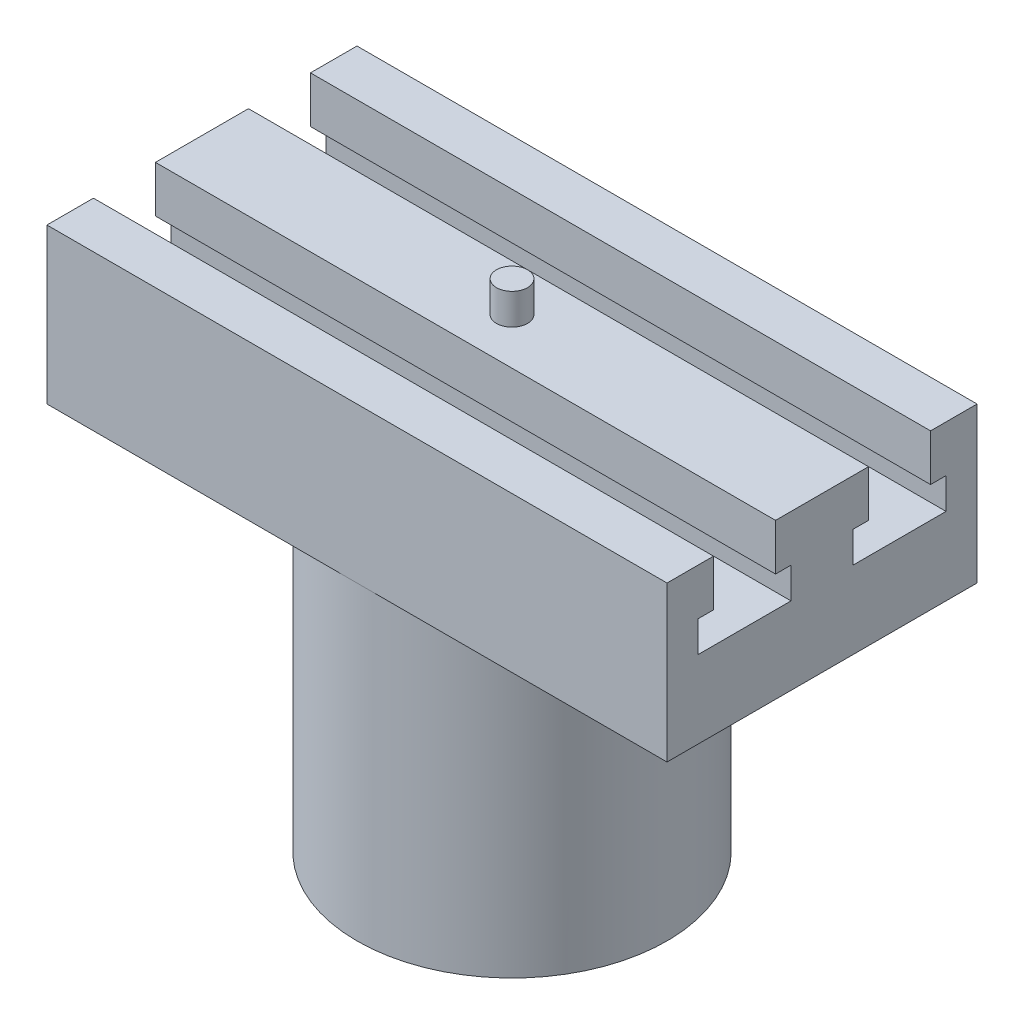
ISO-10303-21;
HEADER;
FILE_DESCRIPTION(('STEP AP214'),'2;1');
FILE_NAME('part.step','',(''),(''),'','','');
FILE_SCHEMA(('AUTOMOTIVE_DESIGN { 1 0 10303 214 1 1 1 1 }'));
ENDSEC;
DATA;
#1=APPLICATION_CONTEXT('core data for automotive mechanical design processes');
#2=APPLICATION_PROTOCOL_DEFINITION('international standard','automotive_design',2000,#1);
#3=PRODUCT_CONTEXT('',#1,'mechanical');
#4=PRODUCT('Part','Part','',(#3));
#5=PRODUCT_RELATED_PRODUCT_CATEGORY('part','',(#4));
#6=PRODUCT_DEFINITION_FORMATION('','',#4);
#7=PRODUCT_DEFINITION_CONTEXT('part definition',#1,'design');
#8=PRODUCT_DEFINITION('design','',#6,#7);
#9=PRODUCT_DEFINITION_SHAPE('','',#8);
#10=(LENGTH_UNIT() NAMED_UNIT(*) SI_UNIT(.MILLI.,.METRE.));
#11=(NAMED_UNIT(*) PLANE_ANGLE_UNIT() SI_UNIT($,.RADIAN.));
#12=(NAMED_UNIT(*) SI_UNIT($,.STERADIAN.) SOLID_ANGLE_UNIT());
#13=UNCERTAINTY_MEASURE_WITH_UNIT(LENGTH_MEASURE(1.E-05),#10,'distance_accuracy_value','');
#14=(GEOMETRIC_REPRESENTATION_CONTEXT(3) GLOBAL_UNCERTAINTY_ASSIGNED_CONTEXT((#13)) GLOBAL_UNIT_ASSIGNED_CONTEXT((#10,
#11,#12)) REPRESENTATION_CONTEXT('',''));
#15=CARTESIAN_POINT('',(0.,0.,0.));
#16=DIRECTION('',(0.,0.,1.));
#17=DIRECTION('',(1.,0.,0.));
#18=AXIS2_PLACEMENT_3D('',#15,#16,#17);
#19=CARTESIAN_POINT('',(0.,150.,0.));
#20=DIRECTION('',(0.,1.,0.));
#21=DIRECTION('',(0.,0.,1.));
#22=AXIS2_PLACEMENT_3D('',#19,#20,#21);
#23=PLANE('',#22);
#24=CARTESIAN_POINT('',(0.,150.,0.));
#25=DIRECTION('',(0.,1.,0.));
#26=DIRECTION('',(0.,0.,1.));
#27=AXIS2_PLACEMENT_3D('',#24,#25,#26);
#28=CIRCLE('',#27,5.);
#29=CARTESIAN_POINT('',(0.,150.,5.));
#30=VERTEX_POINT('',#29);
#31=EDGE_CURVE('E223',#30,#30,#28,.T.);
#32=ORIENTED_EDGE('',*,*,#31,.F.);
#33=EDGE_LOOP('',(#32));
#34=FACE_BOUND('',#33,.T.);
#35=DIRECTION('',(1.,0.,0.));
#36=VECTOR('',#35,1.);
#37=CARTESIAN_POINT('',(-100.,150.,15.0000000000001));
#38=LINE('',#37,#36);
#39=CARTESIAN_POINT('',(-100.,150.,15.0000000000001));
#40=VERTEX_POINT('',#39);
#41=CARTESIAN_POINT('',(100.,150.,15.));
#42=VERTEX_POINT('',#41);
#43=EDGE_CURVE('E264',#40,#42,#38,.T.);
#44=ORIENTED_EDGE('',*,*,#43,.T.);
#45=DIRECTION('',(0.,0.,-1.));
#46=VECTOR('',#45,1.);
#47=CARTESIAN_POINT('',(100.,150.,-50.));
#48=LINE('',#47,#46);
#49=CARTESIAN_POINT('',(100.,150.,-15.));
#50=VERTEX_POINT('',#49);
#51=EDGE_CURVE('E368',#42,#50,#48,.T.);
#52=ORIENTED_EDGE('',*,*,#51,.T.);
#53=DIRECTION('',(1.,0.,0.));
#54=VECTOR('',#53,1.);
#55=CARTESIAN_POINT('',(-100.,150.,-14.9999999999999));
#56=LINE('',#55,#54);
#57=CARTESIAN_POINT('',(-100.,150.,-14.9999999999999));
#58=VERTEX_POINT('',#57);
#59=EDGE_CURVE('E292',#58,#50,#56,.T.);
#60=ORIENTED_EDGE('',*,*,#59,.F.);
#61=DIRECTION('',(0.,0.,1.));
#62=VECTOR('',#61,1.);
#63=CARTESIAN_POINT('',(-100.,150.,-50.));
#64=LINE('',#63,#62);
#65=EDGE_CURVE('E377',#58,#40,#64,.T.);
#66=ORIENTED_EDGE('',*,*,#65,.T.);
#67=EDGE_LOOP('',(#44,#52,#60,#66));
#68=FACE_BOUND('',#67,.T.);
#69=ADVANCED_FACE('F47',(#34,#68),#23,.T.);
#70=DIRECTION('',(1.,0.,0.));
#71=VECTOR('',#70,1.);
#72=CARTESIAN_POINT('',(-100.,150.,35.0000000000001));
#73=LINE('',#72,#71);
#74=CARTESIAN_POINT('',(-100.,150.,35.0000000000001));
#75=VERTEX_POINT('',#74);
#76=CARTESIAN_POINT('',(100.,150.,35.));
#77=VERTEX_POINT('',#76);
#78=EDGE_CURVE('E200',#75,#77,#73,.T.);
#79=ORIENTED_EDGE('',*,*,#78,.F.);
#80=CARTESIAN_POINT('',(-100.,150.,50.));
#81=VERTEX_POINT('',#80);
#82=EDGE_CURVE('E215',#75,#81,#64,.T.);
#83=ORIENTED_EDGE('',*,*,#82,.T.);
#84=DIRECTION('',(1.,0.,0.));
#85=VECTOR('',#84,1.);
#86=CARTESIAN_POINT('',(-100.,150.,50.));
#87=LINE('',#86,#85);
#88=CARTESIAN_POINT('',(100.,150.,50.));
#89=VERTEX_POINT('',#88);
#90=EDGE_CURVE('E376',#81,#89,#87,.T.);
#91=ORIENTED_EDGE('',*,*,#90,.T.);
#92=EDGE_CURVE('E363',#89,#77,#48,.T.);
#93=ORIENTED_EDGE('',*,*,#92,.T.);
#94=EDGE_LOOP('',(#79,#83,#91,#93));
#95=FACE_BOUND('',#94,.T.);
#96=ADVANCED_FACE('F488',(#95),#23,.T.);
#97=CARTESIAN_POINT('',(0.,100.,0.));
#98=DIRECTION('',(0.,-1.,0.));
#99=DIRECTION('',(0.,0.,-1.));
#100=AXIS2_PLACEMENT_3D('',#97,#98,#99);
#101=CYLINDRICAL_SURFACE('',#100,50.);
#102=CARTESIAN_POINT('',(0.,100.,0.));
#103=DIRECTION('',(0.,1.,0.));
#104=DIRECTION('',(0.,0.,1.));
#105=AXIS2_PLACEMENT_3D('',#102,#103,#104);
#106=CIRCLE('',#105,50.);
#107=CARTESIAN_POINT('',(0.,100.,50.));
#108=VERTEX_POINT('',#107);
#109=CARTESIAN_POINT('',(0.,100.,-50.));
#110=VERTEX_POINT('',#109);
#111=EDGE_CURVE('E11',#108,#110,#106,.T.);
#112=ORIENTED_EDGE('',*,*,#111,.F.);
#113=EDGE_CURVE('E57',#110,#108,#106,.T.);
#114=ORIENTED_EDGE('',*,*,#113,.F.);
#115=EDGE_LOOP('',(#112,#114));
#116=FACE_BOUND('',#115,.T.);
#117=CARTESIAN_POINT('',(0.,0.,0.));
#118=DIRECTION('',(0.,1.,0.));
#119=DIRECTION('',(0.,0.,1.));
#120=AXIS2_PLACEMENT_3D('',#117,#118,#119);
#121=CIRCLE('',#120,50.);
#122=CARTESIAN_POINT('',(0.,0.,50.));
#123=VERTEX_POINT('',#122);
#124=EDGE_CURVE('E51',#123,#123,#121,.T.);
#125=ORIENTED_EDGE('',*,*,#124,.T.);
#126=EDGE_LOOP('',(#125));
#127=FACE_BOUND('',#126,.T.);
#128=ADVANCED_FACE('F49',(#116,#127),#101,.T.);
#129=CARTESIAN_POINT('',(0.,0.,0.));
#130=DIRECTION('',(0.,1.,0.));
#131=DIRECTION('',(0.,0.,1.));
#132=AXIS2_PLACEMENT_3D('',#129,#130,#131);
#133=PLANE('',#132);
#134=ORIENTED_EDGE('',*,*,#124,.F.);
#135=EDGE_LOOP('',(#134));
#136=FACE_BOUND('',#135,.T.);
#137=ADVANCED_FACE('F496',(#136),#133,.F.);
#138=CARTESIAN_POINT('',(0.,100.,0.));
#139=DIRECTION('',(0.,1.,0.));
#140=DIRECTION('',(0.,0.,1.));
#141=AXIS2_PLACEMENT_3D('',#138,#139,#140);
#142=PLANE('',#141);
#143=DIRECTION('',(1.,0.,0.));
#144=VECTOR('',#143,1.);
#145=CARTESIAN_POINT('',(-100.,100.,50.));
#146=LINE('',#145,#144);
#147=CARTESIAN_POINT('',(100.,100.,50.));
#148=VERTEX_POINT('',#147);
#149=EDGE_CURVE('E392',#108,#148,#146,.T.);
#150=ORIENTED_EDGE('',*,*,#149,.F.);
#151=ORIENTED_EDGE('',*,*,#111,.T.);
#152=DIRECTION('',(-1.,0.,0.));
#153=VECTOR('',#152,1.);
#154=CARTESIAN_POINT('',(-100.,100.,-50.));
#155=LINE('',#154,#153);
#156=CARTESIAN_POINT('',(100.,100.,-50.));
#157=VERTEX_POINT('',#156);
#158=EDGE_CURVE('E385',#157,#110,#155,.T.);
#159=ORIENTED_EDGE('',*,*,#158,.F.);
#160=DIRECTION('',(0.,0.,-1.));
#161=VECTOR('',#160,1.);
#162=CARTESIAN_POINT('',(100.,100.,-50.));
#163=LINE('',#162,#161);
#164=EDGE_CURVE('E268',#148,#157,#163,.T.);
#165=ORIENTED_EDGE('',*,*,#164,.F.);
#166=EDGE_LOOP('',(#150,#151,#159,#165));
#167=FACE_BOUND('',#166,.T.);
#168=ADVANCED_FACE('F429',(#167),#142,.F.);
#169=CARTESIAN_POINT('',(-100.,100.,-50.));
#170=VERTEX_POINT('',#169);
#171=EDGE_CURVE('E384',#110,#170,#155,.T.);
#172=ORIENTED_EDGE('',*,*,#171,.F.);
#173=ORIENTED_EDGE('',*,*,#113,.T.);
#174=CARTESIAN_POINT('',(-100.,100.,50.));
#175=VERTEX_POINT('',#174);
#176=EDGE_CURVE('E393',#175,#108,#146,.T.);
#177=ORIENTED_EDGE('',*,*,#176,.F.);
#178=DIRECTION('',(0.,0.,1.));
#179=VECTOR('',#178,1.);
#180=CARTESIAN_POINT('',(-100.,100.,-50.));
#181=LINE('',#180,#179);
#182=EDGE_CURVE('E389',#170,#175,#181,.T.);
#183=ORIENTED_EDGE('',*,*,#182,.F.);
#184=EDGE_LOOP('',(#172,#173,#177,#183));
#185=FACE_BOUND('',#184,.T.);
#186=ADVANCED_FACE('F424',(#185),#142,.F.);
#187=CARTESIAN_POINT('',(100.,150.,-50.));
#188=DIRECTION('',(-1.,0.,0.));
#189=DIRECTION('',(0.,0.,1.));
#190=AXIS2_PLACEMENT_3D('',#187,#188,#189);
#191=PLANE('',#190);
#192=ORIENTED_EDGE('',*,*,#51,.F.);
#193=DIRECTION('',(0.,1.,0.));
#194=VECTOR('',#193,1.);
#195=CARTESIAN_POINT('',(100.,150.,15.));
#196=LINE('',#195,#194);
#197=CARTESIAN_POINT('',(100.,135.,15.));
#198=VERTEX_POINT('',#197);
#199=EDGE_CURVE('E217',#198,#42,#196,.T.);
#200=ORIENTED_EDGE('',*,*,#199,.F.);
#201=DIRECTION('',(0.,0.,1.));
#202=VECTOR('',#201,1.);
#203=CARTESIAN_POINT('',(100.,135.,15.));
#204=LINE('',#203,#202);
#205=CARTESIAN_POINT('',(100.,135.,10.));
#206=VERTEX_POINT('',#205);
#207=EDGE_CURVE('E220',#206,#198,#204,.T.);
#208=ORIENTED_EDGE('',*,*,#207,.F.);
#209=DIRECTION('',(0.,1.,0.));
#210=VECTOR('',#209,1.);
#211=CARTESIAN_POINT('',(100.,135.,10.));
#212=LINE('',#211,#210);
#213=CARTESIAN_POINT('',(100.,125.,10.));
#214=VERTEX_POINT('',#213);
#215=EDGE_CURVE('E257',#214,#206,#212,.T.);
#216=ORIENTED_EDGE('',*,*,#215,.F.);
#217=DIRECTION('',(0.,0.,-1.));
#218=VECTOR('',#217,1.);
#219=CARTESIAN_POINT('',(100.,125.,40.));
#220=LINE('',#219,#218);
#221=CARTESIAN_POINT('',(100.,125.,40.));
#222=VERTEX_POINT('',#221);
#223=EDGE_CURVE('E253',#222,#214,#220,.T.);
#224=ORIENTED_EDGE('',*,*,#223,.F.);
#225=DIRECTION('',(0.,-1.,0.));
#226=VECTOR('',#225,1.);
#227=CARTESIAN_POINT('',(100.,135.,40.));
#228=LINE('',#227,#226);
#229=CARTESIAN_POINT('',(100.,135.,40.));
#230=VERTEX_POINT('',#229);
#231=EDGE_CURVE('E249',#230,#222,#228,.T.);
#232=ORIENTED_EDGE('',*,*,#231,.F.);
#233=DIRECTION('',(0.,0.,1.));
#234=VECTOR('',#233,1.);
#235=CARTESIAN_POINT('',(100.,135.,35.));
#236=LINE('',#235,#234);
#237=CARTESIAN_POINT('',(100.,135.,35.));
#238=VERTEX_POINT('',#237);
#239=EDGE_CURVE('E245',#238,#230,#236,.T.);
#240=ORIENTED_EDGE('',*,*,#239,.F.);
#241=DIRECTION('',(0.,-1.,0.));
#242=VECTOR('',#241,1.);
#243=CARTESIAN_POINT('',(100.,150.,35.));
#244=LINE('',#243,#242);
#245=EDGE_CURVE('E194',#77,#238,#244,.T.);
#246=ORIENTED_EDGE('',*,*,#245,.F.);
#247=ORIENTED_EDGE('',*,*,#92,.F.);
#248=DIRECTION('',(0.,-1.,0.));
#249=VECTOR('',#248,1.);
#250=CARTESIAN_POINT('',(100.,150.,50.));
#251=LINE('',#250,#249);
#252=EDGE_CURVE('E380',#89,#148,#251,.T.);
#253=ORIENTED_EDGE('',*,*,#252,.T.);
#254=ORIENTED_EDGE('',*,*,#164,.T.);
#255=DIRECTION('',(0.,-1.,0.));
#256=VECTOR('',#255,1.);
#257=CARTESIAN_POINT('',(100.,150.,-50.));
#258=LINE('',#257,#256);
#259=CARTESIAN_POINT('',(100.,150.,-50.));
#260=VERTEX_POINT('',#259);
#261=EDGE_CURVE('E408',#260,#157,#258,.T.);
#262=ORIENTED_EDGE('',*,*,#261,.F.);
#263=CARTESIAN_POINT('',(100.,150.,-35.));
#264=VERTEX_POINT('',#263);
#265=EDGE_CURVE('E369',#264,#260,#48,.T.);
#266=ORIENTED_EDGE('',*,*,#265,.F.);
#267=DIRECTION('',(0.,1.,0.));
#268=VECTOR('',#267,1.);
#269=CARTESIAN_POINT('',(100.,150.,-35.));
#270=LINE('',#269,#268);
#271=CARTESIAN_POINT('',(100.,135.,-35.));
#272=VERTEX_POINT('',#271);
#273=EDGE_CURVE('E72',#272,#264,#270,.T.);
#274=ORIENTED_EDGE('',*,*,#273,.F.);
#275=DIRECTION('',(0.,0.,1.));
#276=VECTOR('',#275,1.);
#277=CARTESIAN_POINT('',(100.,135.,-35.));
#278=LINE('',#277,#276);
#279=CARTESIAN_POINT('',(100.,135.,-40.));
#280=VERTEX_POINT('',#279);
#281=EDGE_CURVE('E246',#280,#272,#278,.T.);
#282=ORIENTED_EDGE('',*,*,#281,.F.);
#283=DIRECTION('',(0.,1.,0.));
#284=VECTOR('',#283,1.);
#285=CARTESIAN_POINT('',(100.,135.,-40.));
#286=LINE('',#285,#284);
#287=CARTESIAN_POINT('',(100.,125.,-40.));
#288=VERTEX_POINT('',#287);
#289=EDGE_CURVE('E311',#288,#280,#286,.T.);
#290=ORIENTED_EDGE('',*,*,#289,.F.);
#291=DIRECTION('',(0.,0.,-1.));
#292=VECTOR('',#291,1.);
#293=CARTESIAN_POINT('',(100.,125.,-40.));
#294=LINE('',#293,#292);
#295=CARTESIAN_POINT('',(100.,125.,-9.99999999999999));
#296=VERTEX_POINT('',#295);
#297=EDGE_CURVE('E315',#296,#288,#294,.T.);
#298=ORIENTED_EDGE('',*,*,#297,.F.);
#299=DIRECTION('',(0.,-1.,0.));
#300=VECTOR('',#299,1.);
#301=CARTESIAN_POINT('',(100.,135.,-9.99999999999999));
#302=LINE('',#301,#300);
#303=CARTESIAN_POINT('',(100.,135.,-9.99999999999999));
#304=VERTEX_POINT('',#303);
#305=EDGE_CURVE('E320',#304,#296,#302,.T.);
#306=ORIENTED_EDGE('',*,*,#305,.F.);
#307=DIRECTION('',(0.,0.,1.));
#308=VECTOR('',#307,1.);
#309=CARTESIAN_POINT('',(100.,135.,-15.));
#310=LINE('',#309,#308);
#311=CARTESIAN_POINT('',(100.,135.,-15.));
#312=VERTEX_POINT('',#311);
#313=EDGE_CURVE('E324',#312,#304,#310,.T.);
#314=ORIENTED_EDGE('',*,*,#313,.F.);
#315=DIRECTION('',(0.,-1.,0.));
#316=VECTOR('',#315,1.);
#317=CARTESIAN_POINT('',(100.,150.,-15.));
#318=LINE('',#317,#316);
#319=EDGE_CURVE('E328',#50,#312,#318,.T.);
#320=ORIENTED_EDGE('',*,*,#319,.F.);
#321=EDGE_LOOP('',(#192,#200,#208,#216,#224,#232,#240,#246,#247,#253,#254,#262,#266,#274,#282,
#290,#298,#306,#314,#320));
#322=FACE_BOUND('',#321,.T.);
#323=ADVANCED_FACE('F456',(#322),#191,.F.);
#324=CARTESIAN_POINT('',(-100.,150.,-50.));
#325=DIRECTION('',(0.,0.,1.));
#326=DIRECTION('',(1.,0.,0.));
#327=AXIS2_PLACEMENT_3D('',#324,#325,#326);
#328=PLANE('',#327);
#329=ORIENTED_EDGE('',*,*,#158,.T.);
#330=ORIENTED_EDGE('',*,*,#171,.T.);
#331=DIRECTION('',(0.,-1.,0.));
#332=VECTOR('',#331,1.);
#333=CARTESIAN_POINT('',(-100.,150.,-50.));
#334=LINE('',#333,#332);
#335=CARTESIAN_POINT('',(-100.,150.,-50.));
#336=VERTEX_POINT('',#335);
#337=EDGE_CURVE('E404',#336,#170,#334,.T.);
#338=ORIENTED_EDGE('',*,*,#337,.F.);
#339=DIRECTION('',(-1.,0.,0.));
#340=VECTOR('',#339,1.);
#341=CARTESIAN_POINT('',(-100.,150.,-50.));
#342=LINE('',#341,#340);
#343=EDGE_CURVE('E367',#260,#336,#342,.T.);
#344=ORIENTED_EDGE('',*,*,#343,.F.);
#345=ORIENTED_EDGE('',*,*,#261,.T.);
#346=EDGE_LOOP('',(#329,#330,#338,#344,#345));
#347=FACE_BOUND('',#346,.T.);
#348=ADVANCED_FACE('F437',(#347),#328,.F.);
#349=CARTESIAN_POINT('',(-100.,150.,-50.));
#350=DIRECTION('',(1.,0.,0.));
#351=DIRECTION('',(0.,0.,-1.));
#352=AXIS2_PLACEMENT_3D('',#349,#350,#351);
#353=PLANE('',#352);
#354=DIRECTION('',(0.,0.,1.));
#355=VECTOR('',#354,1.);
#356=CARTESIAN_POINT('',(-100.,135.,15.0000000000001));
#357=LINE('',#356,#355);
#358=CARTESIAN_POINT('',(-100.,135.,10.0000000000001));
#359=VERTEX_POINT('',#358);
#360=CARTESIAN_POINT('',(-100.,135.,15.0000000000001));
#361=VERTEX_POINT('',#360);
#362=EDGE_CURVE('E236',#359,#361,#357,.T.);
#363=ORIENTED_EDGE('',*,*,#362,.T.);
#364=DIRECTION('',(0.,1.,0.));
#365=VECTOR('',#364,1.);
#366=CARTESIAN_POINT('',(-100.,150.,15.0000000000001));
#367=LINE('',#366,#365);
#368=EDGE_CURVE('E239',#361,#40,#367,.T.);
#369=ORIENTED_EDGE('',*,*,#368,.T.);
#370=ORIENTED_EDGE('',*,*,#65,.F.);
#371=DIRECTION('',(0.,-1.,0.));
#372=VECTOR('',#371,1.);
#373=CARTESIAN_POINT('',(-100.,150.,-14.9999999999999));
#374=LINE('',#373,#372);
#375=CARTESIAN_POINT('',(-100.,135.,-14.9999999999999));
#376=VERTEX_POINT('',#375);
#377=EDGE_CURVE('E352',#58,#376,#374,.T.);
#378=ORIENTED_EDGE('',*,*,#377,.T.);
#379=DIRECTION('',(0.,0.,1.));
#380=VECTOR('',#379,1.);
#381=CARTESIAN_POINT('',(-100.,135.,-14.9999999999999));
#382=LINE('',#381,#380);
#383=CARTESIAN_POINT('',(-100.,135.,-9.99999999999994));
#384=VERTEX_POINT('',#383);
#385=EDGE_CURVE('E348',#376,#384,#382,.T.);
#386=ORIENTED_EDGE('',*,*,#385,.T.);
#387=DIRECTION('',(0.,-1.,0.));
#388=VECTOR('',#387,1.);
#389=CARTESIAN_POINT('',(-100.,135.,-9.99999999999994));
#390=LINE('',#389,#388);
#391=CARTESIAN_POINT('',(-100.,125.,-9.99999999999994));
#392=VERTEX_POINT('',#391);
#393=EDGE_CURVE('E344',#384,#392,#390,.T.);
#394=ORIENTED_EDGE('',*,*,#393,.T.);
#395=DIRECTION('',(0.,0.,-1.));
#396=VECTOR('',#395,1.);
#397=CARTESIAN_POINT('',(-100.,125.,-39.9999999999999));
#398=LINE('',#397,#396);
#399=CARTESIAN_POINT('',(-100.,125.,-39.9999999999999));
#400=VERTEX_POINT('',#399);
#401=EDGE_CURVE('E340',#392,#400,#398,.T.);
#402=ORIENTED_EDGE('',*,*,#401,.T.);
#403=DIRECTION('',(0.,1.,0.));
#404=VECTOR('',#403,1.);
#405=CARTESIAN_POINT('',(-100.,135.,-39.9999999999999));
#406=LINE('',#405,#404);
#407=CARTESIAN_POINT('',(-100.,135.,-39.9999999999999));
#408=VERTEX_POINT('',#407);
#409=EDGE_CURVE('E288',#400,#408,#406,.T.);
#410=ORIENTED_EDGE('',*,*,#409,.T.);
#411=DIRECTION('',(0.,0.,1.));
#412=VECTOR('',#411,1.);
#413=CARTESIAN_POINT('',(-100.,135.,-34.9999999999999));
#414=LINE('',#413,#412);
#415=CARTESIAN_POINT('',(-100.,135.,-34.9999999999999));
#416=VERTEX_POINT('',#415);
#417=EDGE_CURVE('E316',#408,#416,#414,.T.);
#418=ORIENTED_EDGE('',*,*,#417,.T.);
#419=DIRECTION('',(0.,1.,0.));
#420=VECTOR('',#419,1.);
#421=CARTESIAN_POINT('',(-100.,150.,-34.9999999999999));
#422=LINE('',#421,#420);
#423=CARTESIAN_POINT('',(-100.,150.,-34.9999999999999));
#424=VERTEX_POINT('',#423);
#425=EDGE_CURVE('E356',#416,#424,#422,.T.);
#426=ORIENTED_EDGE('',*,*,#425,.T.);
#427=EDGE_CURVE('E372',#336,#424,#64,.T.);
#428=ORIENTED_EDGE('',*,*,#427,.F.);
#429=ORIENTED_EDGE('',*,*,#337,.T.);
#430=ORIENTED_EDGE('',*,*,#182,.T.);
#431=DIRECTION('',(0.,-1.,0.));
#432=VECTOR('',#431,1.);
#433=CARTESIAN_POINT('',(-100.,150.,50.));
#434=LINE('',#433,#432);
#435=EDGE_CURVE('E400',#81,#175,#434,.T.);
#436=ORIENTED_EDGE('',*,*,#435,.F.);
#437=ORIENTED_EDGE('',*,*,#82,.F.);
#438=DIRECTION('',(0.,-1.,0.));
#439=VECTOR('',#438,1.);
#440=CARTESIAN_POINT('',(-100.,150.,35.0000000000001));
#441=LINE('',#440,#439);
#442=CARTESIAN_POINT('',(-100.,135.,35.0000000000001));
#443=VERTEX_POINT('',#442);
#444=EDGE_CURVE('E64',#75,#443,#441,.T.);
#445=ORIENTED_EDGE('',*,*,#444,.T.);
#446=DIRECTION('',(0.,0.,1.));
#447=VECTOR('',#446,1.);
#448=CARTESIAN_POINT('',(-100.,135.,35.0000000000001));
#449=LINE('',#448,#447);
#450=CARTESIAN_POINT('',(-100.,135.,40.0000000000001));
#451=VERTEX_POINT('',#450);
#452=EDGE_CURVE('E203',#443,#451,#449,.T.);
#453=ORIENTED_EDGE('',*,*,#452,.T.);
#454=DIRECTION('',(0.,-1.,0.));
#455=VECTOR('',#454,1.);
#456=CARTESIAN_POINT('',(-100.,135.,40.0000000000001));
#457=LINE('',#456,#455);
#458=CARTESIAN_POINT('',(-100.,125.,40.0000000000001));
#459=VERTEX_POINT('',#458);
#460=EDGE_CURVE('E209',#451,#459,#457,.T.);
#461=ORIENTED_EDGE('',*,*,#460,.T.);
#462=DIRECTION('',(0.,0.,-1.));
#463=VECTOR('',#462,1.);
#464=CARTESIAN_POINT('',(-100.,125.,40.0000000000001));
#465=LINE('',#464,#463);
#466=CARTESIAN_POINT('',(-100.,125.,10.0000000000001));
#467=VERTEX_POINT('',#466);
#468=EDGE_CURVE('E228',#459,#467,#465,.T.);
#469=ORIENTED_EDGE('',*,*,#468,.T.);
#470=DIRECTION('',(0.,1.,0.));
#471=VECTOR('',#470,1.);
#472=CARTESIAN_POINT('',(-100.,135.,10.0000000000001));
#473=LINE('',#472,#471);
#474=EDGE_CURVE('E232',#467,#359,#473,.T.);
#475=ORIENTED_EDGE('',*,*,#474,.T.);
#476=EDGE_LOOP('',(#363,#369,#370,#378,#386,#394,#402,#410,#418,#426,#428,#429,#430,#436,#437,
#445,#453,#461,#469,#475));
#477=FACE_BOUND('',#476,.T.);
#478=ADVANCED_FACE('F213',(#477),#353,.F.);
#479=CARTESIAN_POINT('',(-100.,150.,50.));
#480=DIRECTION('',(0.,0.,-1.));
#481=DIRECTION('',(-1.,0.,0.));
#482=AXIS2_PLACEMENT_3D('',#479,#480,#481);
#483=PLANE('',#482);
#484=ORIENTED_EDGE('',*,*,#176,.T.);
#485=ORIENTED_EDGE('',*,*,#149,.T.);
#486=ORIENTED_EDGE('',*,*,#252,.F.);
#487=ORIENTED_EDGE('',*,*,#90,.F.);
#488=ORIENTED_EDGE('',*,*,#435,.T.);
#489=EDGE_LOOP('',(#484,#485,#486,#487,#488));
#490=FACE_BOUND('',#489,.T.);
#491=ADVANCED_FACE('F433',(#490),#483,.F.);
#492=DIRECTION('',(1.,0.,0.));
#493=VECTOR('',#492,1.);
#494=CARTESIAN_POINT('',(-100.,150.,-34.9999999999999));
#495=LINE('',#494,#493);
#496=EDGE_CURVE('E289',#424,#264,#495,.T.);
#497=ORIENTED_EDGE('',*,*,#496,.T.);
#498=ORIENTED_EDGE('',*,*,#265,.T.);
#499=ORIENTED_EDGE('',*,*,#343,.T.);
#500=ORIENTED_EDGE('',*,*,#427,.T.);
#501=EDGE_LOOP('',(#497,#498,#499,#500));
#502=FACE_BOUND('',#501,.T.);
#503=ADVANCED_FACE('F485',(#502),#23,.T.);
#504=CARTESIAN_POINT('',(-100.,135.,-34.9999999999999));
#505=DIRECTION('',(0.,1.,0.));
#506=DIRECTION('',(0.,0.,1.));
#507=AXIS2_PLACEMENT_3D('',#504,#505,#506);
#508=PLANE('',#507);
#509=ORIENTED_EDGE('',*,*,#281,.T.);
#510=DIRECTION('',(1.,0.,0.));
#511=VECTOR('',#510,1.);
#512=CARTESIAN_POINT('',(-100.,135.,-34.9999999999999));
#513=LINE('',#512,#511);
#514=EDGE_CURVE('E285',#416,#272,#513,.T.);
#515=ORIENTED_EDGE('',*,*,#514,.F.);
#516=ORIENTED_EDGE('',*,*,#417,.F.);
#517=DIRECTION('',(1.,0.,0.));
#518=VECTOR('',#517,1.);
#519=CARTESIAN_POINT('',(-100.,135.,-39.9999999999999));
#520=LINE('',#519,#518);
#521=EDGE_CURVE('E307',#408,#280,#520,.T.);
#522=ORIENTED_EDGE('',*,*,#521,.T.);
#523=EDGE_LOOP('',(#509,#515,#516,#522));
#524=FACE_BOUND('',#523,.T.);
#525=ADVANCED_FACE('F480',(#524),#508,.F.);
#526=CARTESIAN_POINT('',(-100.,135.,-39.9999999999999));
#527=DIRECTION('',(0.,0.,-1.));
#528=DIRECTION('',(-1.,0.,0.));
#529=AXIS2_PLACEMENT_3D('',#526,#527,#528);
#530=PLANE('',#529);
#531=ORIENTED_EDGE('',*,*,#289,.T.);
#532=ORIENTED_EDGE('',*,*,#521,.F.);
#533=ORIENTED_EDGE('',*,*,#409,.F.);
#534=DIRECTION('',(1.,0.,0.));
#535=VECTOR('',#534,1.);
#536=CARTESIAN_POINT('',(-100.,125.,-39.9999999999999));
#537=LINE('',#536,#535);
#538=EDGE_CURVE('E304',#400,#288,#537,.T.);
#539=ORIENTED_EDGE('',*,*,#538,.T.);
#540=EDGE_LOOP('',(#531,#532,#533,#539));
#541=FACE_BOUND('',#540,.T.);
#542=ADVANCED_FACE('F476',(#541),#530,.F.);
#543=CARTESIAN_POINT('',(-100.,125.,-39.9999999999999));
#544=DIRECTION('',(0.,-1.,0.));
#545=DIRECTION('',(0.,0.,-1.));
#546=AXIS2_PLACEMENT_3D('',#543,#544,#545);
#547=PLANE('',#546);
#548=ORIENTED_EDGE('',*,*,#297,.T.);
#549=ORIENTED_EDGE('',*,*,#538,.F.);
#550=ORIENTED_EDGE('',*,*,#401,.F.);
#551=DIRECTION('',(1.,0.,0.));
#552=VECTOR('',#551,1.);
#553=CARTESIAN_POINT('',(-100.,125.,-9.99999999999994));
#554=LINE('',#553,#552);
#555=EDGE_CURVE('E301',#392,#296,#554,.T.);
#556=ORIENTED_EDGE('',*,*,#555,.T.);
#557=EDGE_LOOP('',(#548,#549,#550,#556));
#558=FACE_BOUND('',#557,.T.);
#559=ADVANCED_FACE('F472',(#558),#547,.F.);
#560=CARTESIAN_POINT('',(-100.,135.,-9.99999999999994));
#561=DIRECTION('',(0.,0.,1.));
#562=DIRECTION('',(1.,0.,0.));
#563=AXIS2_PLACEMENT_3D('',#560,#561,#562);
#564=PLANE('',#563);
#565=ORIENTED_EDGE('',*,*,#305,.T.);
#566=ORIENTED_EDGE('',*,*,#555,.F.);
#567=ORIENTED_EDGE('',*,*,#393,.F.);
#568=DIRECTION('',(1.,0.,0.));
#569=VECTOR('',#568,1.);
#570=CARTESIAN_POINT('',(-100.,135.,-9.99999999999994));
#571=LINE('',#570,#569);
#572=EDGE_CURVE('E298',#384,#304,#571,.T.);
#573=ORIENTED_EDGE('',*,*,#572,.T.);
#574=EDGE_LOOP('',(#565,#566,#567,#573));
#575=FACE_BOUND('',#574,.T.);
#576=ADVANCED_FACE('F469',(#575),#564,.F.);
#577=CARTESIAN_POINT('',(-100.,135.,-14.9999999999999));
#578=DIRECTION('',(0.,1.,0.));
#579=DIRECTION('',(0.,0.,1.));
#580=AXIS2_PLACEMENT_3D('',#577,#578,#579);
#581=PLANE('',#580);
#582=ORIENTED_EDGE('',*,*,#313,.T.);
#583=ORIENTED_EDGE('',*,*,#572,.F.);
#584=ORIENTED_EDGE('',*,*,#385,.F.);
#585=DIRECTION('',(1.,0.,0.));
#586=VECTOR('',#585,1.);
#587=CARTESIAN_POINT('',(-100.,135.,-14.9999999999999));
#588=LINE('',#587,#586);
#589=EDGE_CURVE('E295',#376,#312,#588,.T.);
#590=ORIENTED_EDGE('',*,*,#589,.T.);
#591=EDGE_LOOP('',(#582,#583,#584,#590));
#592=FACE_BOUND('',#591,.T.);
#593=ADVANCED_FACE('F465',(#592),#581,.F.);
#594=CARTESIAN_POINT('',(-100.,150.,-14.9999999999999));
#595=DIRECTION('',(0.,0.,1.));
#596=DIRECTION('',(0.,-1.,0.));
#597=AXIS2_PLACEMENT_3D('',#594,#595,#596);
#598=PLANE('',#597);
#599=ORIENTED_EDGE('',*,*,#319,.T.);
#600=ORIENTED_EDGE('',*,*,#589,.F.);
#601=ORIENTED_EDGE('',*,*,#377,.F.);
#602=ORIENTED_EDGE('',*,*,#59,.T.);
#603=EDGE_LOOP('',(#599,#600,#601,#602));
#604=FACE_BOUND('',#603,.T.);
#605=ADVANCED_FACE('F462',(#604),#598,.F.);
#606=CARTESIAN_POINT('',(-100.,150.,-34.9999999999999));
#607=DIRECTION('',(0.,0.,-1.));
#608=DIRECTION('',(0.,1.,0.));
#609=AXIS2_PLACEMENT_3D('',#606,#607,#608);
#610=PLANE('',#609);
#611=ORIENTED_EDGE('',*,*,#273,.T.);
#612=ORIENTED_EDGE('',*,*,#496,.F.);
#613=ORIENTED_EDGE('',*,*,#425,.F.);
#614=ORIENTED_EDGE('',*,*,#514,.T.);
#615=EDGE_LOOP('',(#611,#612,#613,#614));
#616=FACE_BOUND('',#615,.T.);
#617=ADVANCED_FACE('F482',(#616),#610,.F.);
#618=CARTESIAN_POINT('',(-100.,150.,15.0000000000001));
#619=DIRECTION('',(0.,0.,-1.));
#620=DIRECTION('',(0.,1.,0.));
#621=AXIS2_PLACEMENT_3D('',#618,#619,#620);
#622=PLANE('',#621);
#623=ORIENTED_EDGE('',*,*,#199,.T.);
#624=ORIENTED_EDGE('',*,*,#43,.F.);
#625=ORIENTED_EDGE('',*,*,#368,.F.);
#626=DIRECTION('',(1.,0.,0.));
#627=VECTOR('',#626,1.);
#628=CARTESIAN_POINT('',(-100.,135.,15.0000000000001));
#629=LINE('',#628,#627);
#630=EDGE_CURVE('E269',#361,#198,#629,.T.);
#631=ORIENTED_EDGE('',*,*,#630,.T.);
#632=EDGE_LOOP('',(#623,#624,#625,#631));
#633=FACE_BOUND('',#632,.T.);
#634=ADVANCED_FACE('F452',(#633),#622,.F.);
#635=CARTESIAN_POINT('',(-100.,135.,15.0000000000001));
#636=DIRECTION('',(0.,1.,0.));
#637=DIRECTION('',(0.,0.,1.));
#638=AXIS2_PLACEMENT_3D('',#635,#636,#637);
#639=PLANE('',#638);
#640=ORIENTED_EDGE('',*,*,#207,.T.);
#641=ORIENTED_EDGE('',*,*,#630,.F.);
#642=ORIENTED_EDGE('',*,*,#362,.F.);
#643=DIRECTION('',(1.,0.,0.));
#644=VECTOR('',#643,1.);
#645=CARTESIAN_POINT('',(-100.,135.,10.0000000000001));
#646=LINE('',#645,#644);
#647=EDGE_CURVE('E272',#359,#206,#646,.T.);
#648=ORIENTED_EDGE('',*,*,#647,.T.);
#649=EDGE_LOOP('',(#640,#641,#642,#648));
#650=FACE_BOUND('',#649,.T.);
#651=ADVANCED_FACE('F622',(#650),#639,.F.);
#652=CARTESIAN_POINT('',(-100.,135.,10.0000000000001));
#653=DIRECTION('',(0.,0.,-1.));
#654=DIRECTION('',(-1.,0.,0.));
#655=AXIS2_PLACEMENT_3D('',#652,#653,#654);
#656=PLANE('',#655);
#657=ORIENTED_EDGE('',*,*,#215,.T.);
#658=ORIENTED_EDGE('',*,*,#647,.F.);
#659=ORIENTED_EDGE('',*,*,#474,.F.);
#660=DIRECTION('',(1.,0.,0.));
#661=VECTOR('',#660,1.);
#662=CARTESIAN_POINT('',(-100.,125.,10.0000000000001));
#663=LINE('',#662,#661);
#664=EDGE_CURVE('E275',#467,#214,#663,.T.);
#665=ORIENTED_EDGE('',*,*,#664,.T.);
#666=EDGE_LOOP('',(#657,#658,#659,#665));
#667=FACE_BOUND('',#666,.T.);
#668=ADVANCED_FACE('F631',(#667),#656,.F.);
#669=CARTESIAN_POINT('',(-100.,125.,40.0000000000001));
#670=DIRECTION('',(0.,-1.,0.));
#671=DIRECTION('',(0.,0.,-1.));
#672=AXIS2_PLACEMENT_3D('',#669,#670,#671);
#673=PLANE('',#672);
#674=ORIENTED_EDGE('',*,*,#223,.T.);
#675=ORIENTED_EDGE('',*,*,#664,.F.);
#676=ORIENTED_EDGE('',*,*,#468,.F.);
#677=DIRECTION('',(1.,0.,0.));
#678=VECTOR('',#677,1.);
#679=CARTESIAN_POINT('',(-100.,125.,40.0000000000001));
#680=LINE('',#679,#678);
#681=EDGE_CURVE('E278',#459,#222,#680,.T.);
#682=ORIENTED_EDGE('',*,*,#681,.T.);
#683=EDGE_LOOP('',(#674,#675,#676,#682));
#684=FACE_BOUND('',#683,.T.);
#685=ADVANCED_FACE('F641',(#684),#673,.F.);
#686=CARTESIAN_POINT('',(-100.,135.,40.0000000000001));
#687=DIRECTION('',(0.,0.,1.));
#688=DIRECTION('',(1.,0.,0.));
#689=AXIS2_PLACEMENT_3D('',#686,#687,#688);
#690=PLANE('',#689);
#691=ORIENTED_EDGE('',*,*,#231,.T.);
#692=ORIENTED_EDGE('',*,*,#681,.F.);
#693=ORIENTED_EDGE('',*,*,#460,.F.);
#694=DIRECTION('',(1.,0.,0.));
#695=VECTOR('',#694,1.);
#696=CARTESIAN_POINT('',(-100.,135.,40.0000000000001));
#697=LINE('',#696,#695);
#698=EDGE_CURVE('E199',#451,#230,#697,.T.);
#699=ORIENTED_EDGE('',*,*,#698,.T.);
#700=EDGE_LOOP('',(#691,#692,#693,#699));
#701=FACE_BOUND('',#700,.T.);
#702=ADVANCED_FACE('F651',(#701),#690,.F.);
#703=CARTESIAN_POINT('',(-100.,135.,35.0000000000001));
#704=DIRECTION('',(0.,1.,0.));
#705=DIRECTION('',(0.,0.,1.));
#706=AXIS2_PLACEMENT_3D('',#703,#704,#705);
#707=PLANE('',#706);
#708=ORIENTED_EDGE('',*,*,#239,.T.);
#709=ORIENTED_EDGE('',*,*,#698,.F.);
#710=ORIENTED_EDGE('',*,*,#452,.F.);
#711=DIRECTION('',(1.,0.,0.));
#712=VECTOR('',#711,1.);
#713=CARTESIAN_POINT('',(-100.,135.,35.0000000000001));
#714=LINE('',#713,#712);
#715=EDGE_CURVE('E190',#443,#238,#714,.T.);
#716=ORIENTED_EDGE('',*,*,#715,.T.);
#717=EDGE_LOOP('',(#708,#709,#710,#716));
#718=FACE_BOUND('',#717,.T.);
#719=ADVANCED_FACE('F204',(#718),#707,.F.);
#720=CARTESIAN_POINT('',(-100.,150.,35.0000000000001));
#721=DIRECTION('',(0.,0.,1.));
#722=DIRECTION('',(0.,-1.,0.));
#723=AXIS2_PLACEMENT_3D('',#720,#721,#722);
#724=PLANE('',#723);
#725=ORIENTED_EDGE('',*,*,#245,.T.);
#726=ORIENTED_EDGE('',*,*,#715,.F.);
#727=ORIENTED_EDGE('',*,*,#444,.F.);
#728=ORIENTED_EDGE('',*,*,#78,.T.);
#729=EDGE_LOOP('',(#725,#726,#727,#728));
#730=FACE_BOUND('',#729,.T.);
#731=ADVANCED_FACE('F192',(#730),#724,.F.);
#732=CARTESIAN_POINT('',(0.,160.,0.));
#733=DIRECTION('',(0.,-1.,0.));
#734=DIRECTION('',(0.,0.,-1.));
#735=AXIS2_PLACEMENT_3D('',#732,#733,#734);
#736=CYLINDRICAL_SURFACE('',#735,5.);
#737=CARTESIAN_POINT('',(0.,160.,0.));
#738=DIRECTION('',(0.,1.,0.));
#739=DIRECTION('',(0.,0.,1.));
#740=AXIS2_PLACEMENT_3D('',#737,#738,#739);
#741=CIRCLE('',#740,5.);
#742=CARTESIAN_POINT('',(0.,160.,5.));
#743=VERTEX_POINT('',#742);
#744=EDGE_CURVE('E310',#743,#743,#741,.T.);
#745=ORIENTED_EDGE('',*,*,#744,.F.);
#746=EDGE_LOOP('',(#745));
#747=FACE_BOUND('',#746,.T.);
#748=ORIENTED_EDGE('',*,*,#31,.T.);
#749=EDGE_LOOP('',(#748));
#750=FACE_BOUND('',#749,.T.);
#751=ADVANCED_FACE('F677',(#747,#750),#736,.T.);
#752=CARTESIAN_POINT('',(0.,160.,0.));
#753=DIRECTION('',(0.,1.,0.));
#754=DIRECTION('',(0.,0.,1.));
#755=AXIS2_PLACEMENT_3D('',#752,#753,#754);
#756=PLANE('',#755);
#757=ORIENTED_EDGE('',*,*,#744,.T.);
#758=EDGE_LOOP('',(#757));
#759=FACE_BOUND('',#758,.T.);
#760=ADVANCED_FACE('F685',(#759),#756,.T.);
#761=CLOSED_SHELL('',(#69,#96,#128,#137,#168,#186,#323,#348,#478,#491,#503,#525,#542,#559,#576,
#593,#605,#617,#634,#651,#668,#685,#702,#719,#731,#751,#760));
#762=MANIFOLD_SOLID_BREP('B2',#761);
#763=ADVANCED_BREP_SHAPE_REPRESENTATION('',(#18,#762),#14);
#764=SHAPE_DEFINITION_REPRESENTATION(#9,#763);
ENDSEC;
END-ISO-10303-21;
